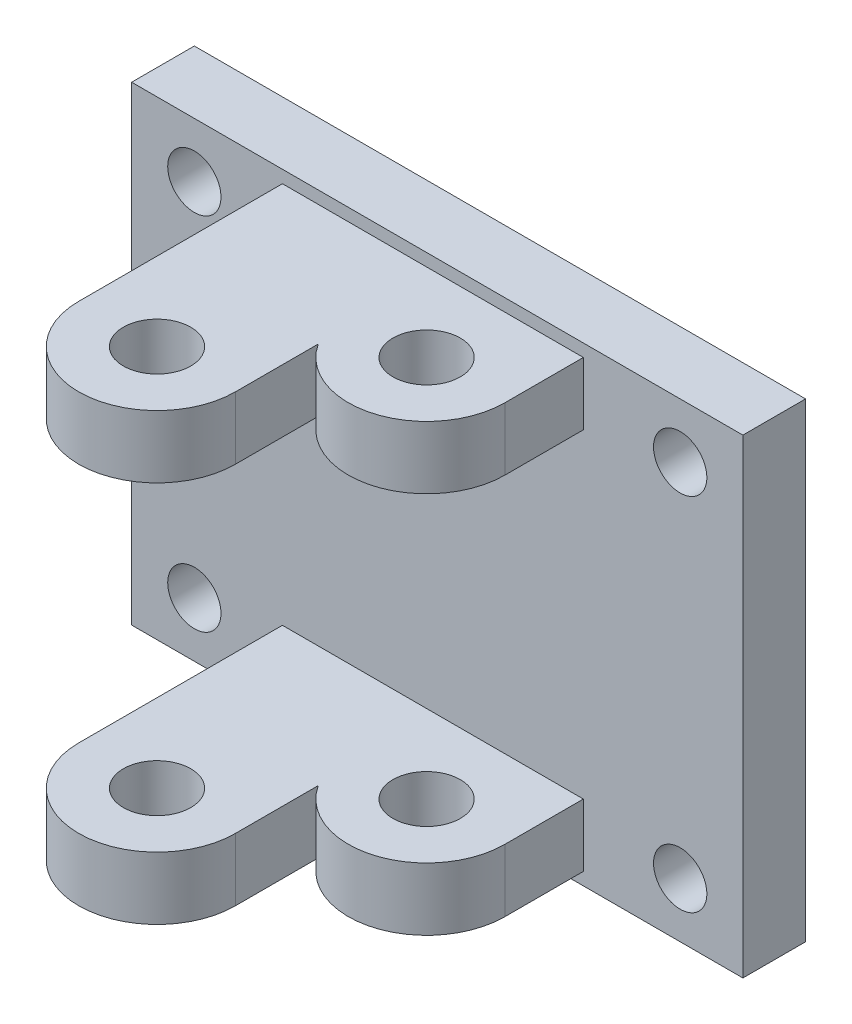
ISO-10303-21;
HEADER;
FILE_DESCRIPTION(('STEP AP214'),'2;1');
FILE_NAME('part.step','',(''),(''),'','','');
FILE_SCHEMA(('AUTOMOTIVE_DESIGN { 1 0 10303 214 1 1 1 1 }'));
ENDSEC;
DATA;
#1=APPLICATION_CONTEXT('core data for automotive mechanical design processes');
#2=APPLICATION_PROTOCOL_DEFINITION('international standard','automotive_design',2000,#1);
#3=PRODUCT_CONTEXT('',#1,'mechanical');
#4=PRODUCT('Part','Part','',(#3));
#5=PRODUCT_RELATED_PRODUCT_CATEGORY('part','',(#4));
#6=PRODUCT_DEFINITION_FORMATION('','',#4);
#7=PRODUCT_DEFINITION_CONTEXT('part definition',#1,'design');
#8=PRODUCT_DEFINITION('design','',#6,#7);
#9=PRODUCT_DEFINITION_SHAPE('','',#8);
#10=(LENGTH_UNIT() NAMED_UNIT(*) SI_UNIT(.MILLI.,.METRE.));
#11=(NAMED_UNIT(*) PLANE_ANGLE_UNIT() SI_UNIT($,.RADIAN.));
#12=(NAMED_UNIT(*) SI_UNIT($,.STERADIAN.) SOLID_ANGLE_UNIT());
#13=UNCERTAINTY_MEASURE_WITH_UNIT(LENGTH_MEASURE(1.E-05),#10,'distance_accuracy_value','');
#14=(GEOMETRIC_REPRESENTATION_CONTEXT(3) GLOBAL_UNCERTAINTY_ASSIGNED_CONTEXT((#13)) GLOBAL_UNIT_ASSIGNED_CONTEXT((#10,
#11,#12)) REPRESENTATION_CONTEXT('',''));
#15=CARTESIAN_POINT('',(0.,0.,0.));
#16=DIRECTION('',(0.,0.,1.));
#17=DIRECTION('',(1.,0.,0.));
#18=AXIS2_PLACEMENT_3D('',#15,#16,#17);
#19=CARTESIAN_POINT('',(42.620525892443,-10.2,21.));
#20=DIRECTION('',(-1.,0.,0.));
#21=DIRECTION('',(0.,0.,1.));
#22=AXIS2_PLACEMENT_3D('',#19,#20,#21);
#23=PLANE('',#22);
#24=DIRECTION('',(0.,-1.,0.));
#25=VECTOR('',#24,1.);
#26=CARTESIAN_POINT('',(42.620525892443,-10.2,15.7129319932486));
#27=LINE('',#26,#25);
#28=CARTESIAN_POINT('',(42.620525892443,-10.2,15.7129319932486));
#29=VERTEX_POINT('',#28);
#30=CARTESIAN_POINT('',(42.620525892443,-14.2,15.7129319932486));
#31=VERTEX_POINT('',#30);
#32=EDGE_CURVE('E153',#29,#31,#27,.T.);
#33=ORIENTED_EDGE('',*,*,#32,.F.);
#34=DIRECTION('',(0.,0.,-1.));
#35=VECTOR('',#34,1.);
#36=CARTESIAN_POINT('',(42.620525892443,-10.2,21.));
#37=LINE('',#36,#35);
#38=CARTESIAN_POINT('',(42.620525892443,-10.2,21.));
#39=VERTEX_POINT('',#38);
#40=EDGE_CURVE('E325',#39,#29,#37,.T.);
#41=ORIENTED_EDGE('',*,*,#40,.F.);
#42=DIRECTION('',(0.,-1.,0.));
#43=VECTOR('',#42,1.);
#44=CARTESIAN_POINT('',(42.620525892443,-10.2,21.));
#45=LINE('',#44,#43);
#46=CARTESIAN_POINT('',(42.620525892443,-14.2,21.));
#47=VERTEX_POINT('',#46);
#48=EDGE_CURVE('E174',#39,#47,#45,.T.);
#49=ORIENTED_EDGE('',*,*,#48,.T.);
#50=DIRECTION('',(0.,0.,-1.));
#51=VECTOR('',#50,1.);
#52=CARTESIAN_POINT('',(42.620525892443,-14.2,21.));
#53=LINE('',#52,#51);
#54=EDGE_CURVE('E167',#47,#31,#53,.T.);
#55=ORIENTED_EDGE('',*,*,#54,.T.);
#56=EDGE_LOOP('',(#33,#41,#49,#55));
#57=FACE_BOUND('',#56,.T.);
#58=ADVANCED_FACE('F39',(#57),#23,.F.);
#59=CARTESIAN_POINT('',(0.,0.,8.));
#60=DIRECTION('',(0.,0.,-1.));
#61=DIRECTION('',(-1.,0.,0.));
#62=AXIS2_PLACEMENT_3D('',#59,#60,#61);
#63=PLANE('',#62);
#64=CARTESIAN_POINT('',(27.,11.5,8.));
#65=DIRECTION('',(0.,0.,-1.));
#66=DIRECTION('',(-1.,0.,0.));
#67=AXIS2_PLACEMENT_3D('',#64,#65,#66);
#68=CIRCLE('',#67,1.7);
#69=CARTESIAN_POINT('',(25.3,11.5,8.));
#70=VERTEX_POINT('',#69);
#71=EDGE_CURVE('E267',#70,#70,#68,.F.);
#72=ORIENTED_EDGE('',*,*,#71,.F.);
#73=EDGE_LOOP('',(#72));
#74=FACE_BOUND('',#73,.T.);
#75=CARTESIAN_POINT('',(58.,-11.5,8.));
#76=DIRECTION('',(0.,0.,-1.));
#77=DIRECTION('',(-1.,0.,0.));
#78=AXIS2_PLACEMENT_3D('',#75,#76,#77);
#79=CIRCLE('',#78,1.7);
#80=CARTESIAN_POINT('',(56.3,-11.5,8.));
#81=VERTEX_POINT('',#80);
#82=EDGE_CURVE('E283',#81,#81,#79,.F.);
#83=ORIENTED_EDGE('',*,*,#82,.F.);
#84=EDGE_LOOP('',(#83));
#85=FACE_BOUND('',#84,.T.);
#86=CARTESIAN_POINT('',(58.,11.5,8.));
#87=DIRECTION('',(0.,0.,-1.));
#88=DIRECTION('',(-1.,0.,0.));
#89=AXIS2_PLACEMENT_3D('',#86,#87,#88);
#90=CIRCLE('',#89,1.7);
#91=CARTESIAN_POINT('',(56.3,11.5,8.));
#92=VERTEX_POINT('',#91);
#93=EDGE_CURVE('E284',#92,#92,#90,.F.);
#94=ORIENTED_EDGE('',*,*,#93,.F.);
#95=EDGE_LOOP('',(#94));
#96=FACE_BOUND('',#95,.T.);
#97=CARTESIAN_POINT('',(27.,-11.5,8.));
#98=DIRECTION('',(0.,0.,-1.));
#99=DIRECTION('',(-1.,0.,0.));
#100=AXIS2_PLACEMENT_3D('',#97,#98,#99);
#101=CIRCLE('',#100,1.7);
#102=CARTESIAN_POINT('',(25.3,-11.5,8.));
#103=VERTEX_POINT('',#102);
#104=EDGE_CURVE('E279',#103,#103,#101,.F.);
#105=ORIENTED_EDGE('',*,*,#104,.F.);
#106=EDGE_LOOP('',(#105));
#107=FACE_BOUND('',#106,.T.);
#108=DIRECTION('',(0.,-1.,0.));
#109=VECTOR('',#108,1.);
#110=CARTESIAN_POINT('',(51.820525892444,-10.2,8.));
#111=LINE('',#110,#109);
#112=CARTESIAN_POINT('',(51.820525892444,-10.2,8.));
#113=VERTEX_POINT('',#112);
#114=CARTESIAN_POINT('',(51.820525892444,-14.2,8.));
#115=VERTEX_POINT('',#114);
#116=EDGE_CURVE('E313',#113,#115,#111,.T.);
#117=ORIENTED_EDGE('',*,*,#116,.T.);
#118=DIRECTION('',(-1.,0.,0.));
#119=VECTOR('',#118,1.);
#120=CARTESIAN_POINT('',(32.620525892443,-14.2,8.));
#121=LINE('',#120,#119);
#122=CARTESIAN_POINT('',(32.620525892443,-14.2,8.));
#123=VERTEX_POINT('',#122);
#124=EDGE_CURVE('E63',#115,#123,#121,.T.);
#125=ORIENTED_EDGE('',*,*,#124,.T.);
#126=DIRECTION('',(0.,-1.,0.));
#127=VECTOR('',#126,1.);
#128=CARTESIAN_POINT('',(32.620525892443,-10.2,8.));
#129=LINE('',#128,#127);
#130=CARTESIAN_POINT('',(32.620525892443,-10.2,8.));
#131=VERTEX_POINT('',#130);
#132=EDGE_CURVE('E184',#131,#123,#129,.T.);
#133=ORIENTED_EDGE('',*,*,#132,.F.);
#134=DIRECTION('',(-1.,0.,0.));
#135=VECTOR('',#134,1.);
#136=CARTESIAN_POINT('',(32.620525892443,-10.2,8.));
#137=LINE('',#136,#135);
#138=EDGE_CURVE('E57',#113,#131,#137,.T.);
#139=ORIENTED_EDGE('',*,*,#138,.F.);
#140=EDGE_LOOP('',(#117,#125,#133,#139));
#141=FACE_BOUND('',#140,.T.);
#142=DIRECTION('',(0.,-1.,0.));
#143=VECTOR('',#142,1.);
#144=CARTESIAN_POINT('',(23.,-15.,8.));
#145=LINE('',#144,#143);
#146=CARTESIAN_POINT('',(23.,15.,8.));
#147=VERTEX_POINT('',#146);
#148=CARTESIAN_POINT('',(23.,-15.,8.));
#149=VERTEX_POINT('',#148);
#150=EDGE_CURVE('E239',#147,#149,#145,.T.);
#151=ORIENTED_EDGE('',*,*,#150,.T.);
#152=DIRECTION('',(1.,0.,0.));
#153=VECTOR('',#152,1.);
#154=CARTESIAN_POINT('',(23.,-15.,8.));
#155=LINE('',#154,#153);
#156=CARTESIAN_POINT('',(62.,-15.,8.));
#157=VERTEX_POINT('',#156);
#158=EDGE_CURVE('E243',#149,#157,#155,.T.);
#159=ORIENTED_EDGE('',*,*,#158,.T.);
#160=DIRECTION('',(0.,1.,0.));
#161=VECTOR('',#160,1.);
#162=CARTESIAN_POINT('',(62.,-15.,8.));
#163=LINE('',#162,#161);
#164=CARTESIAN_POINT('',(62.,15.,8.));
#165=VERTEX_POINT('',#164);
#166=EDGE_CURVE('E246',#157,#165,#163,.T.);
#167=ORIENTED_EDGE('',*,*,#166,.T.);
#168=DIRECTION('',(-1.,0.,0.));
#169=VECTOR('',#168,1.);
#170=CARTESIAN_POINT('',(23.,15.,8.));
#171=LINE('',#170,#169);
#172=EDGE_CURVE('E247',#165,#147,#171,.T.);
#173=ORIENTED_EDGE('',*,*,#172,.T.);
#174=EDGE_LOOP('',(#151,#159,#167,#173));
#175=FACE_BOUND('',#174,.T.);
#176=DIRECTION('',(0.,-1.,0.));
#177=VECTOR('',#176,1.);
#178=CARTESIAN_POINT('',(51.820525892444,14.2,8.));
#179=LINE('',#178,#177);
#180=CARTESIAN_POINT('',(51.820525892444,14.2,8.));
#181=VERTEX_POINT('',#180);
#182=CARTESIAN_POINT('',(51.820525892444,10.2,8.));
#183=VERTEX_POINT('',#182);
#184=EDGE_CURVE('E205',#181,#183,#179,.T.);
#185=ORIENTED_EDGE('',*,*,#184,.T.);
#186=DIRECTION('',(-1.,0.,0.));
#187=VECTOR('',#186,1.);
#188=CARTESIAN_POINT('',(32.620525892443,10.2,8.));
#189=LINE('',#188,#187);
#190=CARTESIAN_POINT('',(32.620525892443,10.2,8.));
#191=VERTEX_POINT('',#190);
#192=EDGE_CURVE('E217',#183,#191,#189,.T.);
#193=ORIENTED_EDGE('',*,*,#192,.T.);
#194=DIRECTION('',(0.,-1.,0.));
#195=VECTOR('',#194,1.);
#196=CARTESIAN_POINT('',(32.620525892443,14.2,8.));
#197=LINE('',#196,#195);
#198=CARTESIAN_POINT('',(32.620525892443,14.2,8.));
#199=VERTEX_POINT('',#198);
#200=EDGE_CURVE('E224',#199,#191,#197,.T.);
#201=ORIENTED_EDGE('',*,*,#200,.F.);
#202=DIRECTION('',(-1.,0.,0.));
#203=VECTOR('',#202,1.);
#204=CARTESIAN_POINT('',(32.620525892443,14.2,8.));
#205=LINE('',#204,#203);
#206=EDGE_CURVE('E221',#181,#199,#205,.T.);
#207=ORIENTED_EDGE('',*,*,#206,.F.);
#208=EDGE_LOOP('',(#185,#193,#201,#207));
#209=FACE_BOUND('',#208,.T.);
#210=ADVANCED_FACE('F332',(#74,#85,#96,#107,#141,#175,#209),#63,.F.);
#211=CARTESIAN_POINT('',(42.620525892443,14.2,21.));
#212=DIRECTION('',(-1.,0.,0.));
#213=DIRECTION('',(0.,0.,1.));
#214=AXIS2_PLACEMENT_3D('',#211,#212,#213);
#215=PLANE('',#214);
#216=DIRECTION('',(0.,-1.,0.));
#217=VECTOR('',#216,1.);
#218=CARTESIAN_POINT('',(42.620525892443,14.2,15.7129319932486));
#219=LINE('',#218,#217);
#220=CARTESIAN_POINT('',(42.620525892443,14.2,15.7129319932486));
#221=VERTEX_POINT('',#220);
#222=CARTESIAN_POINT('',(42.620525892443,10.2,15.7129319932486));
#223=VERTEX_POINT('',#222);
#224=EDGE_CURVE('E195',#221,#223,#219,.T.);
#225=ORIENTED_EDGE('',*,*,#224,.F.);
#226=DIRECTION('',(0.,0.,-1.));
#227=VECTOR('',#226,1.);
#228=CARTESIAN_POINT('',(42.620525892443,14.2,21.));
#229=LINE('',#228,#227);
#230=CARTESIAN_POINT('',(42.620525892443,14.2,21.));
#231=VERTEX_POINT('',#230);
#232=EDGE_CURVE('E218',#231,#221,#229,.T.);
#233=ORIENTED_EDGE('',*,*,#232,.F.);
#234=DIRECTION('',(0.,-1.,0.));
#235=VECTOR('',#234,1.);
#236=CARTESIAN_POINT('',(42.620525892443,14.2,21.));
#237=LINE('',#236,#235);
#238=CARTESIAN_POINT('',(42.620525892443,10.2,21.));
#239=VERTEX_POINT('',#238);
#240=EDGE_CURVE('E234',#231,#239,#237,.T.);
#241=ORIENTED_EDGE('',*,*,#240,.T.);
#242=DIRECTION('',(0.,0.,-1.));
#243=VECTOR('',#242,1.);
#244=CARTESIAN_POINT('',(42.620525892443,10.2,21.));
#245=LINE('',#244,#243);
#246=EDGE_CURVE('E226',#239,#223,#245,.T.);
#247=ORIENTED_EDGE('',*,*,#246,.T.);
#248=EDGE_LOOP('',(#225,#233,#241,#247));
#249=FACE_BOUND('',#248,.T.);
#250=ADVANCED_FACE('F352',(#249),#215,.F.);
#251=CARTESIAN_POINT('',(23.,-15.,8.));
#252=DIRECTION('',(1.,0.,0.));
#253=DIRECTION('',(0.,0.,-1.));
#254=AXIS2_PLACEMENT_3D('',#251,#252,#253);
#255=PLANE('',#254);
#256=DIRECTION('',(0.,-1.,0.));
#257=VECTOR('',#256,1.);
#258=CARTESIAN_POINT('',(23.,-15.,4.));
#259=LINE('',#258,#257);
#260=CARTESIAN_POINT('',(23.,15.,4.));
#261=VERTEX_POINT('',#260);
#262=CARTESIAN_POINT('',(23.,-15.,4.));
#263=VERTEX_POINT('',#262);
#264=EDGE_CURVE('E237',#261,#263,#259,.T.);
#265=ORIENTED_EDGE('',*,*,#264,.T.);
#266=DIRECTION('',(0.,0.,-1.));
#267=VECTOR('',#266,1.);
#268=CARTESIAN_POINT('',(23.,-15.,8.));
#269=LINE('',#268,#267);
#270=EDGE_CURVE('E11',#149,#263,#269,.T.);
#271=ORIENTED_EDGE('',*,*,#270,.F.);
#272=ORIENTED_EDGE('',*,*,#150,.F.);
#273=DIRECTION('',(0.,0.,-1.));
#274=VECTOR('',#273,1.);
#275=CARTESIAN_POINT('',(23.,15.,8.));
#276=LINE('',#275,#274);
#277=EDGE_CURVE('E249',#147,#261,#276,.T.);
#278=ORIENTED_EDGE('',*,*,#277,.T.);
#279=EDGE_LOOP('',(#265,#271,#272,#278));
#280=FACE_BOUND('',#279,.T.);
#281=ADVANCED_FACE('F41',(#280),#255,.F.);
#282=CARTESIAN_POINT('',(23.,-15.,8.));
#283=DIRECTION('',(0.,1.,0.));
#284=DIRECTION('',(0.,0.,1.));
#285=AXIS2_PLACEMENT_3D('',#282,#283,#284);
#286=PLANE('',#285);
#287=DIRECTION('',(1.,0.,0.));
#288=VECTOR('',#287,1.);
#289=CARTESIAN_POINT('',(23.,-15.,4.));
#290=LINE('',#289,#288);
#291=CARTESIAN_POINT('',(62.,-15.,4.));
#292=VERTEX_POINT('',#291);
#293=EDGE_CURVE('E254',#263,#292,#290,.T.);
#294=ORIENTED_EDGE('',*,*,#293,.T.);
#295=DIRECTION('',(0.,0.,-1.));
#296=VECTOR('',#295,1.);
#297=CARTESIAN_POINT('',(62.,-15.,8.));
#298=LINE('',#297,#296);
#299=EDGE_CURVE('E48',#157,#292,#298,.T.);
#300=ORIENTED_EDGE('',*,*,#299,.F.);
#301=ORIENTED_EDGE('',*,*,#158,.F.);
#302=ORIENTED_EDGE('',*,*,#270,.T.);
#303=EDGE_LOOP('',(#294,#300,#301,#302));
#304=FACE_BOUND('',#303,.T.);
#305=ADVANCED_FACE('F397',(#304),#286,.F.);
#306=CARTESIAN_POINT('',(62.,-15.,8.));
#307=DIRECTION('',(-1.,0.,0.));
#308=DIRECTION('',(0.,0.,1.));
#309=AXIS2_PLACEMENT_3D('',#306,#307,#308);
#310=PLANE('',#309);
#311=DIRECTION('',(0.,1.,0.));
#312=VECTOR('',#311,1.);
#313=CARTESIAN_POINT('',(62.,-15.,4.));
#314=LINE('',#313,#312);
#315=CARTESIAN_POINT('',(62.,15.,4.));
#316=VERTEX_POINT('',#315);
#317=EDGE_CURVE('E253',#292,#316,#314,.T.);
#318=ORIENTED_EDGE('',*,*,#317,.T.);
#319=DIRECTION('',(0.,0.,-1.));
#320=VECTOR('',#319,1.);
#321=CARTESIAN_POINT('',(62.,15.,8.));
#322=LINE('',#321,#320);
#323=EDGE_CURVE('E260',#165,#316,#322,.T.);
#324=ORIENTED_EDGE('',*,*,#323,.F.);
#325=ORIENTED_EDGE('',*,*,#166,.F.);
#326=ORIENTED_EDGE('',*,*,#299,.T.);
#327=EDGE_LOOP('',(#318,#324,#325,#326));
#328=FACE_BOUND('',#327,.T.);
#329=ADVANCED_FACE('F398',(#328),#310,.F.);
#330=CARTESIAN_POINT('',(23.,15.,8.));
#331=DIRECTION('',(0.,-1.,0.));
#332=DIRECTION('',(0.,0.,-1.));
#333=AXIS2_PLACEMENT_3D('',#330,#331,#332);
#334=PLANE('',#333);
#335=DIRECTION('',(-1.,0.,0.));
#336=VECTOR('',#335,1.);
#337=CARTESIAN_POINT('',(23.,15.,4.));
#338=LINE('',#337,#336);
#339=EDGE_CURVE('E242',#316,#261,#338,.T.);
#340=ORIENTED_EDGE('',*,*,#339,.T.);
#341=ORIENTED_EDGE('',*,*,#277,.F.);
#342=ORIENTED_EDGE('',*,*,#172,.F.);
#343=ORIENTED_EDGE('',*,*,#323,.T.);
#344=EDGE_LOOP('',(#340,#341,#342,#343));
#345=FACE_BOUND('',#344,.T.);
#346=ADVANCED_FACE('F391',(#345),#334,.F.);
#347=CARTESIAN_POINT('',(0.,0.,4.));
#348=DIRECTION('',(0.,0.,-1.));
#349=DIRECTION('',(-1.,0.,0.));
#350=AXIS2_PLACEMENT_3D('',#347,#348,#349);
#351=PLANE('',#350);
#352=CARTESIAN_POINT('',(27.,11.5,4.));
#353=DIRECTION('',(0.,0.,-1.));
#354=DIRECTION('',(-1.,0.,0.));
#355=AXIS2_PLACEMENT_3D('',#352,#353,#354);
#356=CIRCLE('',#355,1.7);
#357=CARTESIAN_POINT('',(25.3,11.5,4.));
#358=VERTEX_POINT('',#357);
#359=EDGE_CURVE('E43',#358,#358,#356,.F.);
#360=ORIENTED_EDGE('',*,*,#359,.T.);
#361=EDGE_LOOP('',(#360));
#362=FACE_BOUND('',#361,.T.);
#363=CARTESIAN_POINT('',(58.,-11.5,4.));
#364=DIRECTION('',(0.,0.,-1.));
#365=DIRECTION('',(-1.,0.,0.));
#366=AXIS2_PLACEMENT_3D('',#363,#364,#365);
#367=CIRCLE('',#366,1.7);
#368=CARTESIAN_POINT('',(56.3,-11.5,4.));
#369=VERTEX_POINT('',#368);
#370=EDGE_CURVE('E281',#369,#369,#367,.F.);
#371=ORIENTED_EDGE('',*,*,#370,.T.);
#372=EDGE_LOOP('',(#371));
#373=FACE_BOUND('',#372,.T.);
#374=CARTESIAN_POINT('',(58.,11.5,4.));
#375=DIRECTION('',(0.,0.,-1.));
#376=DIRECTION('',(-1.,0.,0.));
#377=AXIS2_PLACEMENT_3D('',#374,#375,#376);
#378=CIRCLE('',#377,1.7);
#379=CARTESIAN_POINT('',(56.3,11.5,4.));
#380=VERTEX_POINT('',#379);
#381=EDGE_CURVE('E278',#380,#380,#378,.F.);
#382=ORIENTED_EDGE('',*,*,#381,.T.);
#383=EDGE_LOOP('',(#382));
#384=FACE_BOUND('',#383,.T.);
#385=CARTESIAN_POINT('',(27.,-11.5,4.));
#386=DIRECTION('',(0.,0.,-1.));
#387=DIRECTION('',(-1.,0.,0.));
#388=AXIS2_PLACEMENT_3D('',#385,#386,#387);
#389=CIRCLE('',#388,1.7);
#390=CARTESIAN_POINT('',(25.3,-11.5,4.));
#391=VERTEX_POINT('',#390);
#392=EDGE_CURVE('E273',#391,#391,#389,.F.);
#393=ORIENTED_EDGE('',*,*,#392,.T.);
#394=EDGE_LOOP('',(#393));
#395=FACE_BOUND('',#394,.T.);
#396=ORIENTED_EDGE('',*,*,#264,.F.);
#397=ORIENTED_EDGE('',*,*,#339,.F.);
#398=ORIENTED_EDGE('',*,*,#317,.F.);
#399=ORIENTED_EDGE('',*,*,#293,.F.);
#400=EDGE_LOOP('',(#396,#397,#398,#399));
#401=FACE_BOUND('',#400,.T.);
#402=ADVANCED_FACE('F387',(#362,#373,#384,#395,#401),#351,.T.);
#403=CARTESIAN_POINT('',(32.620525892443,14.2,21.));
#404=DIRECTION('',(1.,0.,0.));
#405=DIRECTION('',(0.,0.,-1.));
#406=AXIS2_PLACEMENT_3D('',#403,#404,#405);
#407=PLANE('',#406);
#408=DIRECTION('',(0.,0.,1.));
#409=VECTOR('',#408,1.);
#410=CARTESIAN_POINT('',(32.620525892443,10.2,21.));
#411=LINE('',#410,#409);
#412=CARTESIAN_POINT('',(32.620525892443,10.2,21.));
#413=VERTEX_POINT('',#412);
#414=EDGE_CURVE('E213',#191,#413,#411,.T.);
#415=ORIENTED_EDGE('',*,*,#414,.T.);
#416=DIRECTION('',(0.,-1.,0.));
#417=VECTOR('',#416,1.);
#418=CARTESIAN_POINT('',(32.620525892443,14.2,21.));
#419=LINE('',#418,#417);
#420=CARTESIAN_POINT('',(32.620525892443,14.2,21.));
#421=VERTEX_POINT('',#420);
#422=EDGE_CURVE('E240',#421,#413,#419,.T.);
#423=ORIENTED_EDGE('',*,*,#422,.F.);
#424=DIRECTION('',(0.,0.,1.));
#425=VECTOR('',#424,1.);
#426=CARTESIAN_POINT('',(32.620525892443,14.2,21.));
#427=LINE('',#426,#425);
#428=EDGE_CURVE('E219',#199,#421,#427,.T.);
#429=ORIENTED_EDGE('',*,*,#428,.F.);
#430=ORIENTED_EDGE('',*,*,#200,.T.);
#431=EDGE_LOOP('',(#415,#423,#429,#430));
#432=FACE_BOUND('',#431,.T.);
#433=ADVANCED_FACE('F377',(#432),#407,.F.);
#434=CARTESIAN_POINT('',(0.,14.2,0.));
#435=DIRECTION('',(0.,-1.,0.));
#436=DIRECTION('',(0.,0.,-1.));
#437=AXIS2_PLACEMENT_3D('',#434,#435,#436);
#438=PLANE('',#437);
#439=CARTESIAN_POINT('',(37.620525892443,14.2,21.));
#440=DIRECTION('',(0.,-1.,0.));
#441=DIRECTION('',(0.,0.,-1.));
#442=AXIS2_PLACEMENT_3D('',#439,#440,#441);
#443=CIRCLE('',#442,2.15);
#444=CARTESIAN_POINT('',(37.620525892443,14.2,18.85));
#445=VERTEX_POINT('',#444);
#446=EDGE_CURVE('E175',#445,#445,#443,.F.);
#447=ORIENTED_EDGE('',*,*,#446,.F.);
#448=EDGE_LOOP('',(#447));
#449=FACE_BOUND('',#448,.T.);
#450=CARTESIAN_POINT('',(46.820525892444,14.2,13.));
#451=DIRECTION('',(0.,-1.,0.));
#452=DIRECTION('',(0.,0.,-1.));
#453=AXIS2_PLACEMENT_3D('',#450,#451,#452);
#454=CIRCLE('',#453,2.15);
#455=CARTESIAN_POINT('',(46.820525892444,14.2,10.85));
#456=VERTEX_POINT('',#455);
#457=EDGE_CURVE('E274',#456,#456,#454,.F.);
#458=ORIENTED_EDGE('',*,*,#457,.F.);
#459=EDGE_LOOP('',(#458));
#460=FACE_BOUND('',#459,.T.);
#461=ORIENTED_EDGE('',*,*,#232,.T.);
#462=CARTESIAN_POINT('',(46.820525892444,14.2,13.));
#463=DIRECTION('',(0.,1.,0.));
#464=DIRECTION('',(0.,0.,1.));
#465=AXIS2_PLACEMENT_3D('',#462,#463,#464);
#466=CIRCLE('',#465,5.);
#467=CARTESIAN_POINT('',(51.820525892444,14.2,13.));
#468=VERTEX_POINT('',#467);
#469=EDGE_CURVE('E192',#221,#468,#466,.T.);
#470=ORIENTED_EDGE('',*,*,#469,.T.);
#471=DIRECTION('',(0.,0.,-1.));
#472=VECTOR('',#471,1.);
#473=CARTESIAN_POINT('',(51.820525892444,14.2,13.));
#474=LINE('',#473,#472);
#475=EDGE_CURVE('E198',#468,#181,#474,.T.);
#476=ORIENTED_EDGE('',*,*,#475,.T.);
#477=ORIENTED_EDGE('',*,*,#206,.T.);
#478=ORIENTED_EDGE('',*,*,#428,.T.);
#479=CARTESIAN_POINT('',(37.620525892443,14.2,21.));
#480=DIRECTION('',(0.,1.,0.));
#481=DIRECTION('',(0.,0.,1.));
#482=AXIS2_PLACEMENT_3D('',#479,#480,#481);
#483=CIRCLE('',#482,5.);
#484=EDGE_CURVE('E211',#421,#231,#483,.T.);
#485=ORIENTED_EDGE('',*,*,#484,.T.);
#486=EDGE_LOOP('',(#461,#470,#476,#477,#478,#485));
#487=FACE_BOUND('',#486,.T.);
#488=ADVANCED_FACE('F374',(#449,#460,#487),#438,.F.);
#489=CARTESIAN_POINT('',(0.,10.2,0.));
#490=DIRECTION('',(0.,-1.,0.));
#491=DIRECTION('',(0.,0.,-1.));
#492=AXIS2_PLACEMENT_3D('',#489,#490,#491);
#493=PLANE('',#492);
#494=CARTESIAN_POINT('',(37.620525892443,10.2,21.));
#495=DIRECTION('',(0.,-1.,0.));
#496=DIRECTION('',(0.,0.,-1.));
#497=AXIS2_PLACEMENT_3D('',#494,#495,#496);
#498=CIRCLE('',#497,2.15);
#499=CARTESIAN_POINT('',(37.620525892443,10.2,18.85));
#500=VERTEX_POINT('',#499);
#501=EDGE_CURVE('E306',#500,#500,#498,.F.);
#502=ORIENTED_EDGE('',*,*,#501,.T.);
#503=EDGE_LOOP('',(#502));
#504=FACE_BOUND('',#503,.T.);
#505=CARTESIAN_POINT('',(46.820525892444,10.2,13.));
#506=DIRECTION('',(0.,-1.,0.));
#507=DIRECTION('',(0.,0.,-1.));
#508=AXIS2_PLACEMENT_3D('',#505,#506,#507);
#509=CIRCLE('',#508,2.15);
#510=CARTESIAN_POINT('',(46.820525892444,10.2,10.85));
#511=VERTEX_POINT('',#510);
#512=EDGE_CURVE('E299',#511,#511,#509,.F.);
#513=ORIENTED_EDGE('',*,*,#512,.T.);
#514=EDGE_LOOP('',(#513));
#515=FACE_BOUND('',#514,.T.);
#516=DIRECTION('',(0.,0.,-1.));
#517=VECTOR('',#516,1.);
#518=CARTESIAN_POINT('',(51.820525892444,10.2,13.));
#519=LINE('',#518,#517);
#520=CARTESIAN_POINT('',(51.820525892444,10.2,13.));
#521=VERTEX_POINT('',#520);
#522=EDGE_CURVE('E200',#521,#183,#519,.T.);
#523=ORIENTED_EDGE('',*,*,#522,.F.);
#524=CARTESIAN_POINT('',(46.820525892444,10.2,13.));
#525=DIRECTION('',(0.,1.,0.));
#526=DIRECTION('',(0.,0.,1.));
#527=AXIS2_PLACEMENT_3D('',#524,#525,#526);
#528=CIRCLE('',#527,5.);
#529=EDGE_CURVE('E191',#223,#521,#528,.T.);
#530=ORIENTED_EDGE('',*,*,#529,.F.);
#531=ORIENTED_EDGE('',*,*,#246,.F.);
#532=CARTESIAN_POINT('',(37.620525892443,10.2,21.));
#533=DIRECTION('',(0.,1.,0.));
#534=DIRECTION('',(0.,0.,1.));
#535=AXIS2_PLACEMENT_3D('',#532,#533,#534);
#536=CIRCLE('',#535,5.);
#537=EDGE_CURVE('E208',#413,#239,#536,.T.);
#538=ORIENTED_EDGE('',*,*,#537,.F.);
#539=ORIENTED_EDGE('',*,*,#414,.F.);
#540=ORIENTED_EDGE('',*,*,#192,.F.);
#541=EDGE_LOOP('',(#523,#530,#531,#538,#539,#540));
#542=FACE_BOUND('',#541,.T.);
#543=ADVANCED_FACE('F373',(#504,#515,#542),#493,.T.);
#544=CARTESIAN_POINT('',(37.620525892443,14.2,21.));
#545=DIRECTION('',(0.,-1.,0.));
#546=DIRECTION('',(0.,0.,-1.));
#547=AXIS2_PLACEMENT_3D('',#544,#545,#546);
#548=CYLINDRICAL_SURFACE('',#547,5.);
#549=ORIENTED_EDGE('',*,*,#484,.F.);
#550=ORIENTED_EDGE('',*,*,#422,.T.);
#551=ORIENTED_EDGE('',*,*,#537,.T.);
#552=ORIENTED_EDGE('',*,*,#240,.F.);
#553=EDGE_LOOP('',(#549,#550,#551,#552));
#554=FACE_BOUND('',#553,.T.);
#555=ADVANCED_FACE('F367',(#554),#548,.T.);
#556=CARTESIAN_POINT('',(51.820525892444,14.2,13.));
#557=DIRECTION('',(-1.,0.,0.));
#558=DIRECTION('',(0.,0.,1.));
#559=AXIS2_PLACEMENT_3D('',#556,#557,#558);
#560=PLANE('',#559);
#561=ORIENTED_EDGE('',*,*,#522,.T.);
#562=ORIENTED_EDGE('',*,*,#184,.F.);
#563=ORIENTED_EDGE('',*,*,#475,.F.);
#564=DIRECTION('',(0.,-1.,0.));
#565=VECTOR('',#564,1.);
#566=CARTESIAN_POINT('',(51.820525892444,14.2,13.));
#567=LINE('',#566,#565);
#568=EDGE_CURVE('E210',#468,#521,#567,.T.);
#569=ORIENTED_EDGE('',*,*,#568,.T.);
#570=EDGE_LOOP('',(#561,#562,#563,#569));
#571=FACE_BOUND('',#570,.T.);
#572=ADVANCED_FACE('F362',(#571),#560,.F.);
#573=CARTESIAN_POINT('',(46.820525892444,14.2,13.));
#574=DIRECTION('',(0.,-1.,0.));
#575=DIRECTION('',(0.,0.,-1.));
#576=AXIS2_PLACEMENT_3D('',#573,#574,#575);
#577=CYLINDRICAL_SURFACE('',#576,5.);
#578=ORIENTED_EDGE('',*,*,#469,.F.);
#579=ORIENTED_EDGE('',*,*,#224,.T.);
#580=ORIENTED_EDGE('',*,*,#529,.T.);
#581=ORIENTED_EDGE('',*,*,#568,.F.);
#582=EDGE_LOOP('',(#578,#579,#580,#581));
#583=FACE_BOUND('',#582,.T.);
#584=ADVANCED_FACE('F365',(#583),#577,.T.);
#585=CARTESIAN_POINT('',(32.620525892443,-10.2,21.));
#586=DIRECTION('',(1.,0.,0.));
#587=DIRECTION('',(0.,0.,-1.));
#588=AXIS2_PLACEMENT_3D('',#585,#586,#587);
#589=PLANE('',#588);
#590=DIRECTION('',(0.,0.,1.));
#591=VECTOR('',#590,1.);
#592=CARTESIAN_POINT('',(32.620525892443,-14.2,21.));
#593=LINE('',#592,#591);
#594=CARTESIAN_POINT('',(32.620525892443,-14.2,21.));
#595=VERTEX_POINT('',#594);
#596=EDGE_CURVE('E176',#123,#595,#593,.T.);
#597=ORIENTED_EDGE('',*,*,#596,.T.);
#598=DIRECTION('',(0.,-1.,0.));
#599=VECTOR('',#598,1.);
#600=CARTESIAN_POINT('',(32.620525892443,-10.2,21.));
#601=LINE('',#600,#599);
#602=CARTESIAN_POINT('',(32.620525892443,-10.2,21.));
#603=VERTEX_POINT('',#602);
#604=EDGE_CURVE('E186',#603,#595,#601,.T.);
#605=ORIENTED_EDGE('',*,*,#604,.F.);
#606=DIRECTION('',(0.,0.,1.));
#607=VECTOR('',#606,1.);
#608=CARTESIAN_POINT('',(32.620525892443,-10.2,21.));
#609=LINE('',#608,#607);
#610=EDGE_CURVE('E178',#131,#603,#609,.T.);
#611=ORIENTED_EDGE('',*,*,#610,.F.);
#612=ORIENTED_EDGE('',*,*,#132,.T.);
#613=EDGE_LOOP('',(#597,#605,#611,#612));
#614=FACE_BOUND('',#613,.T.);
#615=ADVANCED_FACE('F331',(#614),#589,.F.);
#616=CARTESIAN_POINT('',(0.,-10.2,0.));
#617=DIRECTION('',(0.,-1.,0.));
#618=DIRECTION('',(0.,0.,-1.));
#619=AXIS2_PLACEMENT_3D('',#616,#617,#618);
#620=PLANE('',#619);
#621=CARTESIAN_POINT('',(37.620525892443,-10.2,21.));
#622=DIRECTION('',(0.,-1.,0.));
#623=DIRECTION('',(0.,0.,-1.));
#624=AXIS2_PLACEMENT_3D('',#621,#622,#623);
#625=CIRCLE('',#624,2.15);
#626=CARTESIAN_POINT('',(37.620525892443,-10.2,18.85));
#627=VERTEX_POINT('',#626);
#628=EDGE_CURVE('E271',#627,#627,#625,.F.);
#629=ORIENTED_EDGE('',*,*,#628,.F.);
#630=EDGE_LOOP('',(#629));
#631=FACE_BOUND('',#630,.T.);
#632=CARTESIAN_POINT('',(46.820525892444,-10.2,13.));
#633=DIRECTION('',(0.,-1.,0.));
#634=DIRECTION('',(0.,0.,-1.));
#635=AXIS2_PLACEMENT_3D('',#632,#633,#634);
#636=CIRCLE('',#635,2.15);
#637=CARTESIAN_POINT('',(46.820525892444,-10.2,10.85));
#638=VERTEX_POINT('',#637);
#639=EDGE_CURVE('E266',#638,#638,#636,.F.);
#640=ORIENTED_EDGE('',*,*,#639,.F.);
#641=EDGE_LOOP('',(#640));
#642=FACE_BOUND('',#641,.T.);
#643=ORIENTED_EDGE('',*,*,#40,.T.);
#644=CARTESIAN_POINT('',(46.820525892444,-10.2,13.));
#645=DIRECTION('',(0.,1.,0.));
#646=DIRECTION('',(0.,0.,1.));
#647=AXIS2_PLACEMENT_3D('',#644,#645,#646);
#648=CIRCLE('',#647,5.);
#649=CARTESIAN_POINT('',(51.820525892444,-10.2,13.));
#650=VERTEX_POINT('',#649);
#651=EDGE_CURVE('E159',#29,#650,#648,.T.);
#652=ORIENTED_EDGE('',*,*,#651,.T.);
#653=DIRECTION('',(0.,0.,-1.));
#654=VECTOR('',#653,1.);
#655=CARTESIAN_POINT('',(51.820525892444,-10.2,13.));
#656=LINE('',#655,#654);
#657=EDGE_CURVE('E315',#650,#113,#656,.T.);
#658=ORIENTED_EDGE('',*,*,#657,.T.);
#659=ORIENTED_EDGE('',*,*,#138,.T.);
#660=ORIENTED_EDGE('',*,*,#610,.T.);
#661=CARTESIAN_POINT('',(37.620525892443,-10.2,21.));
#662=DIRECTION('',(0.,1.,0.));
#663=DIRECTION('',(0.,0.,1.));
#664=AXIS2_PLACEMENT_3D('',#661,#662,#663);
#665=CIRCLE('',#664,5.);
#666=EDGE_CURVE('E181',#603,#39,#665,.T.);
#667=ORIENTED_EDGE('',*,*,#666,.T.);
#668=EDGE_LOOP('',(#643,#652,#658,#659,#660,#667));
#669=FACE_BOUND('',#668,.T.);
#670=ADVANCED_FACE('F330',(#631,#642,#669),#620,.F.);
#671=CARTESIAN_POINT('',(0.,-14.2,0.));
#672=DIRECTION('',(0.,-1.,0.));
#673=DIRECTION('',(0.,0.,-1.));
#674=AXIS2_PLACEMENT_3D('',#671,#672,#673);
#675=PLANE('',#674);
#676=CARTESIAN_POINT('',(37.620525892443,-14.2,21.));
#677=DIRECTION('',(0.,-1.,0.));
#678=DIRECTION('',(0.,0.,-1.));
#679=AXIS2_PLACEMENT_3D('',#676,#677,#678);
#680=CIRCLE('',#679,2.15);
#681=CARTESIAN_POINT('',(37.620525892443,-14.2,18.85));
#682=VERTEX_POINT('',#681);
#683=EDGE_CURVE('E269',#682,#682,#680,.F.);
#684=ORIENTED_EDGE('',*,*,#683,.T.);
#685=EDGE_LOOP('',(#684));
#686=FACE_BOUND('',#685,.T.);
#687=CARTESIAN_POINT('',(46.820525892444,-14.2,13.));
#688=DIRECTION('',(0.,-1.,0.));
#689=DIRECTION('',(0.,0.,-1.));
#690=AXIS2_PLACEMENT_3D('',#687,#688,#689);
#691=CIRCLE('',#690,2.15);
#692=CARTESIAN_POINT('',(46.820525892444,-14.2,10.85));
#693=VERTEX_POINT('',#692);
#694=EDGE_CURVE('E262',#693,#693,#691,.F.);
#695=ORIENTED_EDGE('',*,*,#694,.T.);
#696=EDGE_LOOP('',(#695));
#697=FACE_BOUND('',#696,.T.);
#698=DIRECTION('',(0.,0.,-1.));
#699=VECTOR('',#698,1.);
#700=CARTESIAN_POINT('',(51.820525892444,-14.2,13.));
#701=LINE('',#700,#699);
#702=CARTESIAN_POINT('',(51.820525892444,-14.2,13.));
#703=VERTEX_POINT('',#702);
#704=EDGE_CURVE('E164',#703,#115,#701,.T.);
#705=ORIENTED_EDGE('',*,*,#704,.F.);
#706=CARTESIAN_POINT('',(46.820525892444,-14.2,13.));
#707=DIRECTION('',(0.,1.,0.));
#708=DIRECTION('',(0.,0.,1.));
#709=AXIS2_PLACEMENT_3D('',#706,#707,#708);
#710=CIRCLE('',#709,5.);
#711=EDGE_CURVE('E160',#31,#703,#710,.T.);
#712=ORIENTED_EDGE('',*,*,#711,.F.);
#713=ORIENTED_EDGE('',*,*,#54,.F.);
#714=CARTESIAN_POINT('',(37.620525892443,-14.2,21.));
#715=DIRECTION('',(0.,1.,0.));
#716=DIRECTION('',(0.,0.,1.));
#717=AXIS2_PLACEMENT_3D('',#714,#715,#716);
#718=CIRCLE('',#717,5.);
#719=EDGE_CURVE('E316',#595,#47,#718,.T.);
#720=ORIENTED_EDGE('',*,*,#719,.F.);
#721=ORIENTED_EDGE('',*,*,#596,.F.);
#722=ORIENTED_EDGE('',*,*,#124,.F.);
#723=EDGE_LOOP('',(#705,#712,#713,#720,#721,#722));
#724=FACE_BOUND('',#723,.T.);
#725=ADVANCED_FACE('F166',(#686,#697,#724),#675,.T.);
#726=CARTESIAN_POINT('',(37.620525892443,-10.2,21.));
#727=DIRECTION('',(0.,-1.,0.));
#728=DIRECTION('',(0.,0.,-1.));
#729=AXIS2_PLACEMENT_3D('',#726,#727,#728);
#730=CYLINDRICAL_SURFACE('',#729,5.);
#731=ORIENTED_EDGE('',*,*,#666,.F.);
#732=ORIENTED_EDGE('',*,*,#604,.T.);
#733=ORIENTED_EDGE('',*,*,#719,.T.);
#734=ORIENTED_EDGE('',*,*,#48,.F.);
#735=EDGE_LOOP('',(#731,#732,#733,#734));
#736=FACE_BOUND('',#735,.T.);
#737=ADVANCED_FACE('F340',(#736),#730,.T.);
#738=CARTESIAN_POINT('',(51.820525892444,-10.2,13.));
#739=DIRECTION('',(-1.,0.,0.));
#740=DIRECTION('',(0.,0.,1.));
#741=AXIS2_PLACEMENT_3D('',#738,#739,#740);
#742=PLANE('',#741);
#743=ORIENTED_EDGE('',*,*,#704,.T.);
#744=ORIENTED_EDGE('',*,*,#116,.F.);
#745=ORIENTED_EDGE('',*,*,#657,.F.);
#746=DIRECTION('',(0.,-1.,0.));
#747=VECTOR('',#746,1.);
#748=CARTESIAN_POINT('',(51.820525892444,-10.2,13.));
#749=LINE('',#748,#747);
#750=EDGE_CURVE('E320',#650,#703,#749,.T.);
#751=ORIENTED_EDGE('',*,*,#750,.T.);
#752=EDGE_LOOP('',(#743,#744,#745,#751));
#753=FACE_BOUND('',#752,.T.);
#754=ADVANCED_FACE('F339',(#753),#742,.F.);
#755=CARTESIAN_POINT('',(46.820525892444,-10.2,13.));
#756=DIRECTION('',(0.,-1.,0.));
#757=DIRECTION('',(0.,0.,-1.));
#758=AXIS2_PLACEMENT_3D('',#755,#756,#757);
#759=CYLINDRICAL_SURFACE('',#758,5.);
#760=ORIENTED_EDGE('',*,*,#651,.F.);
#761=ORIENTED_EDGE('',*,*,#32,.T.);
#762=ORIENTED_EDGE('',*,*,#711,.T.);
#763=ORIENTED_EDGE('',*,*,#750,.F.);
#764=EDGE_LOOP('',(#760,#761,#762,#763));
#765=FACE_BOUND('',#764,.T.);
#766=ADVANCED_FACE('F158',(#765),#759,.T.);
#767=CARTESIAN_POINT('',(46.820525892444,15.,13.));
#768=DIRECTION('',(0.,-1.,0.));
#769=DIRECTION('',(0.,0.,-1.));
#770=AXIS2_PLACEMENT_3D('',#767,#768,#769);
#771=CYLINDRICAL_SURFACE('',#770,2.15);
#772=ORIENTED_EDGE('',*,*,#694,.F.);
#773=EDGE_LOOP('',(#772));
#774=FACE_BOUND('',#773,.T.);
#775=ORIENTED_EDGE('',*,*,#639,.T.);
#776=EDGE_LOOP('',(#775));
#777=FACE_BOUND('',#776,.T.);
#778=ADVANCED_FACE('F349',(#774,#777),#771,.F.);
#779=CARTESIAN_POINT('',(37.620525892443,15.,21.));
#780=DIRECTION('',(0.,-1.,0.));
#781=DIRECTION('',(0.,0.,-1.));
#782=AXIS2_PLACEMENT_3D('',#779,#780,#781);
#783=CYLINDRICAL_SURFACE('',#782,2.15);
#784=ORIENTED_EDGE('',*,*,#683,.F.);
#785=EDGE_LOOP('',(#784));
#786=FACE_BOUND('',#785,.T.);
#787=ORIENTED_EDGE('',*,*,#628,.T.);
#788=EDGE_LOOP('',(#787));
#789=FACE_BOUND('',#788,.T.);
#790=ADVANCED_FACE('F584',(#786,#789),#783,.F.);
#791=ORIENTED_EDGE('',*,*,#512,.F.);
#792=EDGE_LOOP('',(#791));
#793=FACE_BOUND('',#792,.T.);
#794=ORIENTED_EDGE('',*,*,#457,.T.);
#795=EDGE_LOOP('',(#794));
#796=FACE_BOUND('',#795,.T.);
#797=ADVANCED_FACE('F589',(#793,#796),#771,.F.);
#798=ORIENTED_EDGE('',*,*,#501,.F.);
#799=EDGE_LOOP('',(#798));
#800=FACE_BOUND('',#799,.T.);
#801=ORIENTED_EDGE('',*,*,#446,.T.);
#802=EDGE_LOOP('',(#801));
#803=FACE_BOUND('',#802,.T.);
#804=ADVANCED_FACE('F597',(#800,#803),#783,.F.);
#805=CARTESIAN_POINT('',(27.,-11.5,26.));
#806=DIRECTION('',(0.,0.,-1.));
#807=DIRECTION('',(-1.,0.,0.));
#808=AXIS2_PLACEMENT_3D('',#805,#806,#807);
#809=CYLINDRICAL_SURFACE('',#808,1.7);
#810=ORIENTED_EDGE('',*,*,#392,.F.);
#811=EDGE_LOOP('',(#810));
#812=FACE_BOUND('',#811,.T.);
#813=ORIENTED_EDGE('',*,*,#104,.T.);
#814=EDGE_LOOP('',(#813));
#815=FACE_BOUND('',#814,.T.);
#816=ADVANCED_FACE('F615',(#812,#815),#809,.F.);
#817=CARTESIAN_POINT('',(58.,11.5,26.));
#818=DIRECTION('',(0.,0.,-1.));
#819=DIRECTION('',(-1.,0.,0.));
#820=AXIS2_PLACEMENT_3D('',#817,#818,#819);
#821=CYLINDRICAL_SURFACE('',#820,1.7);
#822=ORIENTED_EDGE('',*,*,#381,.F.);
#823=EDGE_LOOP('',(#822));
#824=FACE_BOUND('',#823,.T.);
#825=ORIENTED_EDGE('',*,*,#93,.T.);
#826=EDGE_LOOP('',(#825));
#827=FACE_BOUND('',#826,.T.);
#828=ADVANCED_FACE('F619',(#824,#827),#821,.F.);
#829=CARTESIAN_POINT('',(58.,-11.5,26.));
#830=DIRECTION('',(0.,0.,-1.));
#831=DIRECTION('',(-1.,0.,0.));
#832=AXIS2_PLACEMENT_3D('',#829,#830,#831);
#833=CYLINDRICAL_SURFACE('',#832,1.7);
#834=ORIENTED_EDGE('',*,*,#370,.F.);
#835=EDGE_LOOP('',(#834));
#836=FACE_BOUND('',#835,.T.);
#837=ORIENTED_EDGE('',*,*,#82,.T.);
#838=EDGE_LOOP('',(#837));
#839=FACE_BOUND('',#838,.T.);
#840=ADVANCED_FACE('F629',(#836,#839),#833,.F.);
#841=CARTESIAN_POINT('',(27.,11.5,26.));
#842=DIRECTION('',(0.,0.,-1.));
#843=DIRECTION('',(-1.,0.,0.));
#844=AXIS2_PLACEMENT_3D('',#841,#842,#843);
#845=CYLINDRICAL_SURFACE('',#844,1.7);
#846=ORIENTED_EDGE('',*,*,#359,.F.);
#847=EDGE_LOOP('',(#846));
#848=FACE_BOUND('',#847,.T.);
#849=ORIENTED_EDGE('',*,*,#71,.T.);
#850=EDGE_LOOP('',(#849));
#851=FACE_BOUND('',#850,.T.);
#852=ADVANCED_FACE('F639',(#848,#851),#845,.F.);
#853=CLOSED_SHELL('',(#58,#210,#250,#281,#305,#329,#346,#402,#433,#488,#543,#555,#572,#584,#615,
#670,#725,#737,#754,#766,#778,#790,#797,#804,#816,#828,#840,#852));
#854=MANIFOLD_SOLID_BREP('B2',#853);
#855=ADVANCED_BREP_SHAPE_REPRESENTATION('',(#18,#854),#14);
#856=SHAPE_DEFINITION_REPRESENTATION(#9,#855);
ENDSEC;
END-ISO-10303-21;
